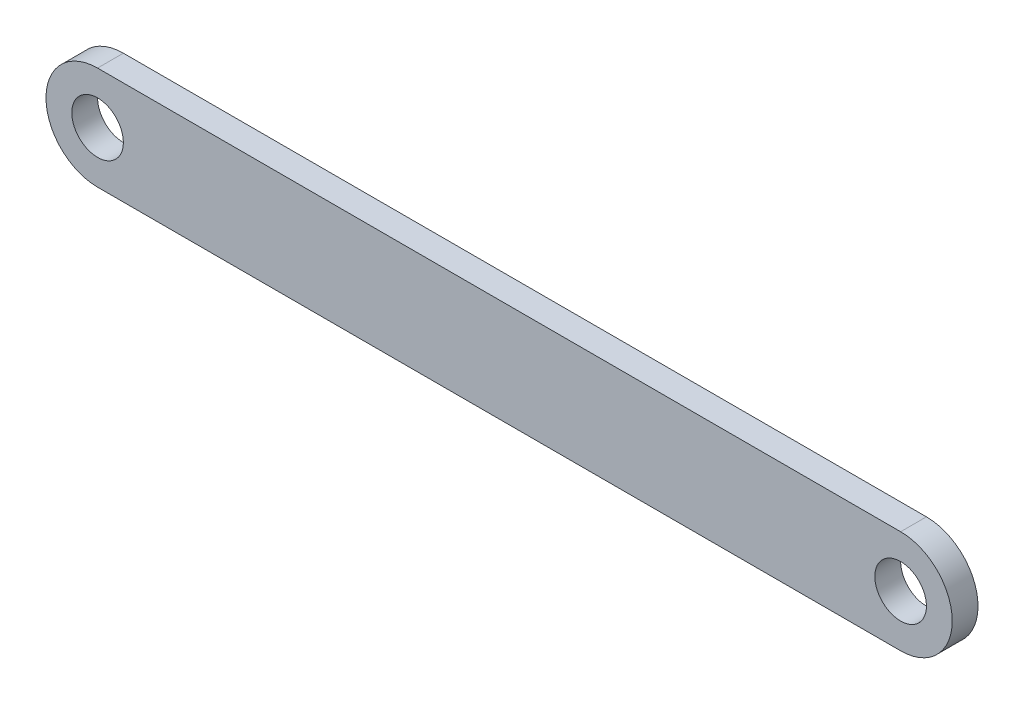
ISO-10303-21;
HEADER;
FILE_DESCRIPTION(('STEP AP214'),'2;1');
FILE_NAME('part.step','',(''),(''),'','','');
FILE_SCHEMA(('AUTOMOTIVE_DESIGN { 1 0 10303 214 1 1 1 1 }'));
ENDSEC;
DATA;
#1=APPLICATION_CONTEXT('core data for automotive mechanical design processes');
#2=APPLICATION_PROTOCOL_DEFINITION('international standard','automotive_design',2000,#1);
#3=PRODUCT_CONTEXT('',#1,'mechanical');
#4=PRODUCT('Part','Part','',(#3));
#5=PRODUCT_RELATED_PRODUCT_CATEGORY('part','',(#4));
#6=PRODUCT_DEFINITION_FORMATION('','',#4);
#7=PRODUCT_DEFINITION_CONTEXT('part definition',#1,'design');
#8=PRODUCT_DEFINITION('design','',#6,#7);
#9=PRODUCT_DEFINITION_SHAPE('','',#8);
#10=(LENGTH_UNIT() NAMED_UNIT(*) SI_UNIT(.MILLI.,.METRE.));
#11=(NAMED_UNIT(*) PLANE_ANGLE_UNIT() SI_UNIT($,.RADIAN.));
#12=(NAMED_UNIT(*) SI_UNIT($,.STERADIAN.) SOLID_ANGLE_UNIT());
#13=UNCERTAINTY_MEASURE_WITH_UNIT(LENGTH_MEASURE(1.E-05),#10,'distance_accuracy_value','');
#14=(GEOMETRIC_REPRESENTATION_CONTEXT(3) GLOBAL_UNCERTAINTY_ASSIGNED_CONTEXT((#13)) GLOBAL_UNIT_ASSIGNED_CONTEXT((#10,
#11,#12)) REPRESENTATION_CONTEXT('',''));
#15=CARTESIAN_POINT('',(0.,0.,0.));
#16=DIRECTION('',(0.,0.,1.));
#17=DIRECTION('',(1.,0.,0.));
#18=AXIS2_PLACEMENT_3D('',#15,#16,#17);
#19=CARTESIAN_POINT('',(0.,-25.4000000000001,6.35));
#20=DIRECTION('',(0.,1.,0.));
#21=DIRECTION('',(-1.,0.,0.));
#22=AXIS2_PLACEMENT_3D('',#19,#20,#21);
#23=PLANE('',#22);
#24=DIRECTION('',(1.,0.,0.));
#25=VECTOR('',#24,1.);
#26=CARTESIAN_POINT('',(0.,-25.4000000000001,-6.35));
#27=LINE('',#26,#25);
#28=CARTESIAN_POINT('',(-197.739,-25.4000000000001,-6.35));
#29=VERTEX_POINT('',#28);
#30=CARTESIAN_POINT('',(197.739,-25.4000000000001,-6.35));
#31=VERTEX_POINT('',#30);
#32=EDGE_CURVE('E107',#29,#31,#27,.T.);
#33=ORIENTED_EDGE('',*,*,#32,.T.);
#34=DIRECTION('',(0.,0.,-1.));
#35=VECTOR('',#34,1.);
#36=CARTESIAN_POINT('',(197.739,-25.4000000000001,6.35));
#37=LINE('',#36,#35);
#38=CARTESIAN_POINT('',(197.739,-25.4000000000001,6.35));
#39=VERTEX_POINT('',#38);
#40=EDGE_CURVE('E11',#39,#31,#37,.T.);
#41=ORIENTED_EDGE('',*,*,#40,.F.);
#42=DIRECTION('',(1.,0.,0.));
#43=VECTOR('',#42,1.);
#44=CARTESIAN_POINT('',(0.,-25.4000000000001,6.35));
#45=LINE('',#44,#43);
#46=CARTESIAN_POINT('',(-197.739,-25.4000000000001,6.35));
#47=VERTEX_POINT('',#46);
#48=EDGE_CURVE('E86',#47,#39,#45,.T.);
#49=ORIENTED_EDGE('',*,*,#48,.F.);
#50=DIRECTION('',(0.,0.,-1.));
#51=VECTOR('',#50,1.);
#52=CARTESIAN_POINT('',(-197.739,-25.4000000000001,6.35));
#53=LINE('',#52,#51);
#54=EDGE_CURVE('E103',#47,#29,#53,.T.);
#55=ORIENTED_EDGE('',*,*,#54,.T.);
#56=EDGE_LOOP('',(#33,#41,#49,#55));
#57=FACE_BOUND('',#56,.T.);
#58=ADVANCED_FACE('F37',(#57),#23,.F.);
#59=CARTESIAN_POINT('',(197.739,0.,6.35));
#60=DIRECTION('',(0.,0.,-1.));
#61=DIRECTION('',(-1.,0.,0.));
#62=AXIS2_PLACEMENT_3D('',#59,#60,#61);
#63=CYLINDRICAL_SURFACE('',#62,25.4);
#64=CARTESIAN_POINT('',(197.739,0.,-6.35));
#65=DIRECTION('',(0.,0.,1.));
#66=DIRECTION('',(1.,0.,0.));
#67=AXIS2_PLACEMENT_3D('',#64,#65,#66);
#68=CIRCLE('',#67,25.4);
#69=CARTESIAN_POINT('',(197.739,25.3999999999999,-6.35));
#70=VERTEX_POINT('',#69);
#71=EDGE_CURVE('E91',#31,#70,#68,.T.);
#72=ORIENTED_EDGE('',*,*,#71,.T.);
#73=DIRECTION('',(0.,0.,-1.));
#74=VECTOR('',#73,1.);
#75=CARTESIAN_POINT('',(197.739,25.3999999999999,6.35));
#76=LINE('',#75,#74);
#77=CARTESIAN_POINT('',(197.739,25.3999999999999,6.35));
#78=VERTEX_POINT('',#77);
#79=EDGE_CURVE('E46',#78,#70,#76,.T.);
#80=ORIENTED_EDGE('',*,*,#79,.F.);
#81=CARTESIAN_POINT('',(197.739,0.,6.35));
#82=DIRECTION('',(0.,0.,1.));
#83=DIRECTION('',(1.,0.,0.));
#84=AXIS2_PLACEMENT_3D('',#81,#82,#83);
#85=CIRCLE('',#84,25.4);
#86=EDGE_CURVE('E80',#39,#78,#85,.T.);
#87=ORIENTED_EDGE('',*,*,#86,.F.);
#88=ORIENTED_EDGE('',*,*,#40,.T.);
#89=EDGE_LOOP('',(#72,#80,#87,#88));
#90=FACE_BOUND('',#89,.T.);
#91=ADVANCED_FACE('F90',(#90),#63,.T.);
#92=CARTESIAN_POINT('',(0.,25.3999999999999,6.35));
#93=DIRECTION('',(0.,1.,0.));
#94=DIRECTION('',(-1.,0.,0.));
#95=AXIS2_PLACEMENT_3D('',#92,#93,#94);
#96=PLANE('',#95);
#97=DIRECTION('',(1.,0.,0.));
#98=VECTOR('',#97,1.);
#99=CARTESIAN_POINT('',(0.,25.3999999999999,-6.35));
#100=LINE('',#99,#98);
#101=CARTESIAN_POINT('',(-197.739,25.3999999999999,-6.35));
#102=VERTEX_POINT('',#101);
#103=EDGE_CURVE('E111',#102,#70,#100,.T.);
#104=ORIENTED_EDGE('',*,*,#103,.F.);
#105=DIRECTION('',(0.,0.,-1.));
#106=VECTOR('',#105,1.);
#107=CARTESIAN_POINT('',(-197.739,25.3999999999999,6.35));
#108=LINE('',#107,#106);
#109=CARTESIAN_POINT('',(-197.739,25.3999999999999,6.35));
#110=VERTEX_POINT('',#109);
#111=EDGE_CURVE('E70',#110,#102,#108,.T.);
#112=ORIENTED_EDGE('',*,*,#111,.F.);
#113=DIRECTION('',(1.,0.,0.));
#114=VECTOR('',#113,1.);
#115=CARTESIAN_POINT('',(0.,25.3999999999999,6.35));
#116=LINE('',#115,#114);
#117=EDGE_CURVE('E84',#110,#78,#116,.T.);
#118=ORIENTED_EDGE('',*,*,#117,.T.);
#119=ORIENTED_EDGE('',*,*,#79,.T.);
#120=EDGE_LOOP('',(#104,#112,#118,#119));
#121=FACE_BOUND('',#120,.T.);
#122=ADVANCED_FACE('F95',(#121),#96,.T.);
#123=CARTESIAN_POINT('',(-197.739,-1.19151642929002E-13,6.35));
#124=DIRECTION('',(0.,0.,-1.));
#125=DIRECTION('',(-1.,0.,0.));
#126=AXIS2_PLACEMENT_3D('',#123,#124,#125);
#127=CYLINDRICAL_SURFACE('',#126,25.4);
#128=CARTESIAN_POINT('',(-197.739,-1.19151642929002E-13,-6.35));
#129=DIRECTION('',(0.,0.,1.));
#130=DIRECTION('',(1.,0.,0.));
#131=AXIS2_PLACEMENT_3D('',#128,#129,#130);
#132=CIRCLE('',#131,25.4);
#133=EDGE_CURVE('E73',#102,#29,#132,.T.);
#134=ORIENTED_EDGE('',*,*,#133,.T.);
#135=ORIENTED_EDGE('',*,*,#54,.F.);
#136=CARTESIAN_POINT('',(-197.739,-1.19151642929002E-13,6.35));
#137=DIRECTION('',(0.,0.,1.));
#138=DIRECTION('',(1.,0.,0.));
#139=AXIS2_PLACEMENT_3D('',#136,#137,#138);
#140=CIRCLE('',#139,25.4);
#141=EDGE_CURVE('E54',#110,#47,#140,.T.);
#142=ORIENTED_EDGE('',*,*,#141,.F.);
#143=ORIENTED_EDGE('',*,*,#111,.T.);
#144=EDGE_LOOP('',(#134,#135,#142,#143));
#145=FACE_BOUND('',#144,.T.);
#146=ADVANCED_FACE('F139',(#145),#127,.T.);
#147=CARTESIAN_POINT('',(-197.739,-1.19151642929002E-13,6.35));
#148=DIRECTION('',(0.,0.,-1.));
#149=DIRECTION('',(-1.,0.,0.));
#150=AXIS2_PLACEMENT_3D('',#147,#148,#149);
#151=CYLINDRICAL_SURFACE('',#150,12.7);
#152=CARTESIAN_POINT('',(-197.739,-1.19151642929002E-13,6.35));
#153=DIRECTION('',(0.,0.,1.));
#154=DIRECTION('',(1.,0.,0.));
#155=AXIS2_PLACEMENT_3D('',#152,#153,#154);
#156=CIRCLE('',#155,12.7);
#157=CARTESIAN_POINT('',(-185.039,-1.19151642929002E-13,6.35));
#158=VERTEX_POINT('',#157);
#159=EDGE_CURVE('E117',#158,#158,#156,.T.);
#160=ORIENTED_EDGE('',*,*,#159,.T.);
#161=EDGE_LOOP('',(#160));
#162=FACE_BOUND('',#161,.T.);
#163=CARTESIAN_POINT('',(-197.739,-1.19151642929002E-13,-6.35));
#164=DIRECTION('',(0.,0.,1.));
#165=DIRECTION('',(1.,0.,0.));
#166=AXIS2_PLACEMENT_3D('',#163,#164,#165);
#167=CIRCLE('',#166,12.7);
#168=CARTESIAN_POINT('',(-185.039,-1.19151642929002E-13,-6.35));
#169=VERTEX_POINT('',#168);
#170=EDGE_CURVE('E104',#169,#169,#167,.T.);
#171=ORIENTED_EDGE('',*,*,#170,.F.);
#172=EDGE_LOOP('',(#171));
#173=FACE_BOUND('',#172,.T.);
#174=ADVANCED_FACE('F39',(#162,#173),#151,.F.);
#175=CARTESIAN_POINT('',(197.739,-1.19151642929002E-13,6.35));
#176=DIRECTION('',(0.,0.,-1.));
#177=DIRECTION('',(-1.,0.,0.));
#178=AXIS2_PLACEMENT_3D('',#175,#176,#177);
#179=CYLINDRICAL_SURFACE('',#178,12.7);
#180=CARTESIAN_POINT('',(197.739,-1.19151642929002E-13,6.35));
#181=DIRECTION('',(0.,0.,1.));
#182=DIRECTION('',(1.,0.,0.));
#183=AXIS2_PLACEMENT_3D('',#180,#181,#182);
#184=CIRCLE('',#183,12.7);
#185=CARTESIAN_POINT('',(210.439,-1.19151642929002E-13,6.35));
#186=VERTEX_POINT('',#185);
#187=EDGE_CURVE('E97',#186,#186,#184,.F.);
#188=ORIENTED_EDGE('',*,*,#187,.F.);
#189=EDGE_LOOP('',(#188));
#190=FACE_BOUND('',#189,.T.);
#191=CARTESIAN_POINT('',(197.739,-1.19151642929002E-13,-6.35));
#192=DIRECTION('',(0.,0.,1.));
#193=DIRECTION('',(1.,0.,0.));
#194=AXIS2_PLACEMENT_3D('',#191,#192,#193);
#195=CIRCLE('',#194,12.7);
#196=CARTESIAN_POINT('',(210.439,-1.19151642929002E-13,-6.35));
#197=VERTEX_POINT('',#196);
#198=EDGE_CURVE('E114',#197,#197,#195,.F.);
#199=ORIENTED_EDGE('',*,*,#198,.T.);
#200=EDGE_LOOP('',(#199));
#201=FACE_BOUND('',#200,.T.);
#202=ADVANCED_FACE('F129',(#190,#201),#179,.F.);
#203=CARTESIAN_POINT('',(0.,0.,6.35));
#204=DIRECTION('',(0.,0.,1.));
#205=DIRECTION('',(1.,0.,0.));
#206=AXIS2_PLACEMENT_3D('',#203,#204,#205);
#207=PLANE('',#206);
#208=ORIENTED_EDGE('',*,*,#159,.F.);
#209=EDGE_LOOP('',(#208));
#210=FACE_BOUND('',#209,.T.);
#211=ORIENTED_EDGE('',*,*,#48,.T.);
#212=ORIENTED_EDGE('',*,*,#86,.T.);
#213=ORIENTED_EDGE('',*,*,#117,.F.);
#214=ORIENTED_EDGE('',*,*,#141,.T.);
#215=EDGE_LOOP('',(#211,#212,#213,#214));
#216=FACE_BOUND('',#215,.T.);
#217=ORIENTED_EDGE('',*,*,#187,.T.);
#218=EDGE_LOOP('',(#217));
#219=FACE_BOUND('',#218,.T.);
#220=ADVANCED_FACE('F81',(#210,#216,#219),#207,.T.);
#221=CARTESIAN_POINT('',(0.,0.,-6.35));
#222=DIRECTION('',(0.,0.,1.));
#223=DIRECTION('',(1.,0.,0.));
#224=AXIS2_PLACEMENT_3D('',#221,#222,#223);
#225=PLANE('',#224);
#226=ORIENTED_EDGE('',*,*,#170,.T.);
#227=EDGE_LOOP('',(#226));
#228=FACE_BOUND('',#227,.T.);
#229=ORIENTED_EDGE('',*,*,#32,.F.);
#230=ORIENTED_EDGE('',*,*,#133,.F.);
#231=ORIENTED_EDGE('',*,*,#103,.T.);
#232=ORIENTED_EDGE('',*,*,#71,.F.);
#233=EDGE_LOOP('',(#229,#230,#231,#232));
#234=FACE_BOUND('',#233,.T.);
#235=ORIENTED_EDGE('',*,*,#198,.F.);
#236=EDGE_LOOP('',(#235));
#237=FACE_BOUND('',#236,.T.);
#238=ADVANCED_FACE('F122',(#228,#234,#237),#225,.F.);
#239=CLOSED_SHELL('',(#58,#91,#122,#146,#174,#202,#220,#238));
#240=MANIFOLD_SOLID_BREP('B2',#239);
#241=ADVANCED_BREP_SHAPE_REPRESENTATION('',(#18,#240),#14);
#242=SHAPE_DEFINITION_REPRESENTATION(#9,#241);
ENDSEC;
END-ISO-10303-21;
